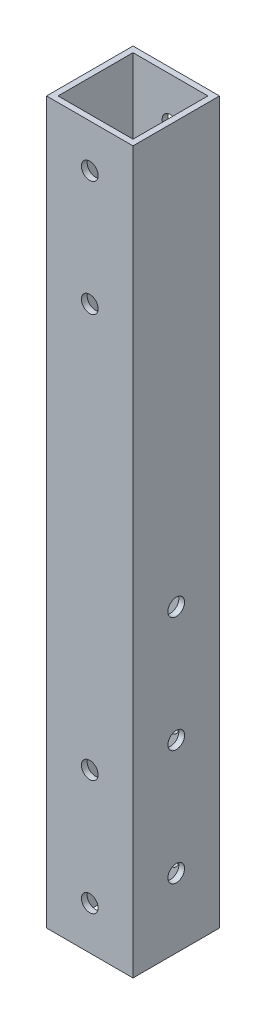
ISO-10303-21;
HEADER;
FILE_DESCRIPTION(('STEP AP214'),'2;1');
FILE_NAME('part.step','',(''),(''),'','','');
FILE_SCHEMA(('AUTOMOTIVE_DESIGN { 1 0 10303 214 1 1 1 1 }'));
ENDSEC;
DATA;
#1=APPLICATION_CONTEXT('core data for automotive mechanical design processes');
#2=APPLICATION_PROTOCOL_DEFINITION('international standard','automotive_design',2000,#1);
#3=PRODUCT_CONTEXT('',#1,'mechanical');
#4=PRODUCT('Part','Part','',(#3));
#5=PRODUCT_RELATED_PRODUCT_CATEGORY('part','',(#4));
#6=PRODUCT_DEFINITION_FORMATION('','',#4);
#7=PRODUCT_DEFINITION_CONTEXT('part definition',#1,'design');
#8=PRODUCT_DEFINITION('design','',#6,#7);
#9=PRODUCT_DEFINITION_SHAPE('','',#8);
#10=(LENGTH_UNIT() NAMED_UNIT(*) SI_UNIT(.MILLI.,.METRE.));
#11=(NAMED_UNIT(*) PLANE_ANGLE_UNIT() SI_UNIT($,.RADIAN.));
#12=(NAMED_UNIT(*) SI_UNIT($,.STERADIAN.) SOLID_ANGLE_UNIT());
#13=UNCERTAINTY_MEASURE_WITH_UNIT(LENGTH_MEASURE(1.E-05),#10,'distance_accuracy_value','');
#14=(GEOMETRIC_REPRESENTATION_CONTEXT(3) GLOBAL_UNCERTAINTY_ASSIGNED_CONTEXT((#13)) GLOBAL_UNIT_ASSIGNED_CONTEXT((#10,
#11,#12)) REPRESENTATION_CONTEXT('',''));
#15=CARTESIAN_POINT('',(0.,0.,0.));
#16=DIRECTION('',(0.,0.,1.));
#17=DIRECTION('',(1.,0.,0.));
#18=AXIS2_PLACEMENT_3D('',#15,#16,#17);
#19=CARTESIAN_POINT('',(0.,125.,0.));
#20=DIRECTION('',(0.,1.,0.));
#21=DIRECTION('',(0.,0.,1.));
#22=AXIS2_PLACEMENT_3D('',#19,#20,#21);
#23=PLANE('',#22);
#24=DIRECTION('',(0.,0.,-1.));
#25=VECTOR('',#24,1.);
#26=CARTESIAN_POINT('',(7.5,125.,7.5));
#27=LINE('',#26,#25);
#28=CARTESIAN_POINT('',(7.5,125.,7.5));
#29=VERTEX_POINT('',#28);
#30=CARTESIAN_POINT('',(7.5,125.,-7.5));
#31=VERTEX_POINT('',#30);
#32=EDGE_CURVE('E187',#29,#31,#27,.T.);
#33=ORIENTED_EDGE('',*,*,#32,.T.);
#34=DIRECTION('',(-1.,0.,0.));
#35=VECTOR('',#34,1.);
#36=CARTESIAN_POINT('',(-7.5,125.,-7.5));
#37=LINE('',#36,#35);
#38=CARTESIAN_POINT('',(-7.5,125.,-7.5));
#39=VERTEX_POINT('',#38);
#40=EDGE_CURVE('E191',#31,#39,#37,.T.);
#41=ORIENTED_EDGE('',*,*,#40,.T.);
#42=DIRECTION('',(0.,0.,1.));
#43=VECTOR('',#42,1.);
#44=CARTESIAN_POINT('',(-7.5,125.,7.5));
#45=LINE('',#44,#43);
#46=CARTESIAN_POINT('',(-7.5,125.,7.5));
#47=VERTEX_POINT('',#46);
#48=EDGE_CURVE('E195',#39,#47,#45,.T.);
#49=ORIENTED_EDGE('',*,*,#48,.T.);
#50=DIRECTION('',(1.,0.,0.));
#51=VECTOR('',#50,1.);
#52=CARTESIAN_POINT('',(-7.5,125.,7.5));
#53=LINE('',#52,#51);
#54=EDGE_CURVE('E198',#47,#29,#53,.T.);
#55=ORIENTED_EDGE('',*,*,#54,.T.);
#56=EDGE_LOOP('',(#33,#41,#49,#55));
#57=FACE_BOUND('',#56,.T.);
#58=DIRECTION('',(-1.,0.,0.));
#59=VECTOR('',#58,1.);
#60=CARTESIAN_POINT('',(0.,125.,-6.5));
#61=LINE('',#60,#59);
#62=CARTESIAN_POINT('',(6.5,125.,-6.5));
#63=VERTEX_POINT('',#62);
#64=CARTESIAN_POINT('',(-6.5,125.,-6.5));
#65=VERTEX_POINT('',#64);
#66=EDGE_CURVE('E146',#63,#65,#61,.T.);
#67=ORIENTED_EDGE('',*,*,#66,.F.);
#68=DIRECTION('',(0.,0.,-1.));
#69=VECTOR('',#68,1.);
#70=CARTESIAN_POINT('',(6.5,125.,0.));
#71=LINE('',#70,#69);
#72=CARTESIAN_POINT('',(6.5,125.,6.5));
#73=VERTEX_POINT('',#72);
#74=EDGE_CURVE('E137',#73,#63,#71,.T.);
#75=ORIENTED_EDGE('',*,*,#74,.F.);
#76=DIRECTION('',(1.,0.,0.));
#77=VECTOR('',#76,1.);
#78=CARTESIAN_POINT('',(0.,125.,6.5));
#79=LINE('',#78,#77);
#80=CARTESIAN_POINT('',(-6.5,125.,6.5));
#81=VERTEX_POINT('',#80);
#82=EDGE_CURVE('E163',#81,#73,#79,.T.);
#83=ORIENTED_EDGE('',*,*,#82,.F.);
#84=DIRECTION('',(0.,0.,1.));
#85=VECTOR('',#84,1.);
#86=CARTESIAN_POINT('',(-6.5,125.,0.));
#87=LINE('',#86,#85);
#88=EDGE_CURVE('E159',#65,#81,#87,.T.);
#89=ORIENTED_EDGE('',*,*,#88,.F.);
#90=EDGE_LOOP('',(#67,#75,#83,#89));
#91=FACE_BOUND('',#90,.T.);
#92=ADVANCED_FACE('F69',(#57,#91),#23,.T.);
#93=CARTESIAN_POINT('',(0.,0.,0.));
#94=DIRECTION('',(0.,1.,0.));
#95=DIRECTION('',(0.,0.,1.));
#96=AXIS2_PLACEMENT_3D('',#93,#94,#95);
#97=PLANE('',#96);
#98=DIRECTION('',(0.,0.,-1.));
#99=VECTOR('',#98,1.);
#100=CARTESIAN_POINT('',(7.5,0.,7.5));
#101=LINE('',#100,#99);
#102=CARTESIAN_POINT('',(7.5,0.,7.5));
#103=VERTEX_POINT('',#102);
#104=CARTESIAN_POINT('',(7.5,0.,-7.5));
#105=VERTEX_POINT('',#104);
#106=EDGE_CURVE('E155',#103,#105,#101,.T.);
#107=ORIENTED_EDGE('',*,*,#106,.F.);
#108=DIRECTION('',(1.,0.,0.));
#109=VECTOR('',#108,1.);
#110=CARTESIAN_POINT('',(-7.5,0.,7.5));
#111=LINE('',#110,#109);
#112=CARTESIAN_POINT('',(-7.5,0.,7.5));
#113=VERTEX_POINT('',#112);
#114=EDGE_CURVE('E192',#113,#103,#111,.T.);
#115=ORIENTED_EDGE('',*,*,#114,.F.);
#116=DIRECTION('',(0.,0.,1.));
#117=VECTOR('',#116,1.);
#118=CARTESIAN_POINT('',(-7.5,0.,7.5));
#119=LINE('',#118,#117);
#120=CARTESIAN_POINT('',(-7.5,0.,-7.5));
#121=VERTEX_POINT('',#120);
#122=EDGE_CURVE('E208',#121,#113,#119,.T.);
#123=ORIENTED_EDGE('',*,*,#122,.F.);
#124=DIRECTION('',(-1.,0.,0.));
#125=VECTOR('',#124,1.);
#126=CARTESIAN_POINT('',(-7.5,0.,-7.5));
#127=LINE('',#126,#125);
#128=EDGE_CURVE('E205',#105,#121,#127,.T.);
#129=ORIENTED_EDGE('',*,*,#128,.F.);
#130=EDGE_LOOP('',(#107,#115,#123,#129));
#131=FACE_BOUND('',#130,.T.);
#132=DIRECTION('',(0.,0.,-1.));
#133=VECTOR('',#132,1.);
#134=CARTESIAN_POINT('',(6.5,0.,0.));
#135=LINE('',#134,#133);
#136=CARTESIAN_POINT('',(6.5,0.,6.5));
#137=VERTEX_POINT('',#136);
#138=CARTESIAN_POINT('',(6.5,0.,-6.5));
#139=VERTEX_POINT('',#138);
#140=EDGE_CURVE('E95',#137,#139,#135,.T.);
#141=ORIENTED_EDGE('',*,*,#140,.T.);
#142=DIRECTION('',(-1.,0.,0.));
#143=VECTOR('',#142,1.);
#144=CARTESIAN_POINT('',(0.,0.,-6.5));
#145=LINE('',#144,#143);
#146=CARTESIAN_POINT('',(-6.5,0.,-6.5));
#147=VERTEX_POINT('',#146);
#148=EDGE_CURVE('E153',#139,#147,#145,.T.);
#149=ORIENTED_EDGE('',*,*,#148,.T.);
#150=DIRECTION('',(0.,0.,1.));
#151=VECTOR('',#150,1.);
#152=CARTESIAN_POINT('',(-6.5,0.,0.));
#153=LINE('',#152,#151);
#154=CARTESIAN_POINT('',(-6.5,0.,6.5));
#155=VERTEX_POINT('',#154);
#156=EDGE_CURVE('E174',#147,#155,#153,.T.);
#157=ORIENTED_EDGE('',*,*,#156,.T.);
#158=DIRECTION('',(1.,0.,0.));
#159=VECTOR('',#158,1.);
#160=CARTESIAN_POINT('',(0.,0.,6.5));
#161=LINE('',#160,#159);
#162=EDGE_CURVE('E147',#155,#137,#161,.T.);
#163=ORIENTED_EDGE('',*,*,#162,.T.);
#164=EDGE_LOOP('',(#141,#149,#157,#163));
#165=FACE_BOUND('',#164,.T.);
#166=ADVANCED_FACE('F349',(#131,#165),#97,.F.);
#167=CARTESIAN_POINT('',(7.5,125.,7.5));
#168=DIRECTION('',(-1.,0.,0.));
#169=DIRECTION('',(0.,0.,1.));
#170=AXIS2_PLACEMENT_3D('',#167,#168,#169);
#171=PLANE('',#170);
#172=CARTESIAN_POINT('',(7.5,52.,0.));
#173=DIRECTION('',(1.,0.,0.));
#174=DIRECTION('',(0.,0.,-1.));
#175=AXIS2_PLACEMENT_3D('',#172,#173,#174);
#176=CIRCLE('',#175,1.45);
#177=CARTESIAN_POINT('',(7.5,52.,-1.45));
#178=VERTEX_POINT('',#177);
#179=EDGE_CURVE('E393',#178,#178,#176,.T.);
#180=ORIENTED_EDGE('',*,*,#179,.F.);
#181=EDGE_LOOP('',(#180));
#182=FACE_BOUND('',#181,.T.);
#183=CARTESIAN_POINT('',(7.5,12.,0.));
#184=DIRECTION('',(1.,0.,0.));
#185=DIRECTION('',(0.,0.,-1.));
#186=AXIS2_PLACEMENT_3D('',#183,#184,#185);
#187=CIRCLE('',#186,1.45);
#188=CARTESIAN_POINT('',(7.5,12.,-1.45));
#189=VERTEX_POINT('',#188);
#190=EDGE_CURVE('E389',#189,#189,#187,.T.);
#191=ORIENTED_EDGE('',*,*,#190,.F.);
#192=EDGE_LOOP('',(#191));
#193=FACE_BOUND('',#192,.T.);
#194=CARTESIAN_POINT('',(7.5,32.,0.));
#195=DIRECTION('',(1.,0.,0.));
#196=DIRECTION('',(0.,0.,-1.));
#197=AXIS2_PLACEMENT_3D('',#194,#195,#196);
#198=CIRCLE('',#197,1.45);
#199=CARTESIAN_POINT('',(7.5,32.,-1.45));
#200=VERTEX_POINT('',#199);
#201=EDGE_CURVE('E263',#200,#200,#198,.T.);
#202=ORIENTED_EDGE('',*,*,#201,.F.);
#203=EDGE_LOOP('',(#202));
#204=FACE_BOUND('',#203,.T.);
#205=ORIENTED_EDGE('',*,*,#106,.T.);
#206=DIRECTION('',(0.,-1.,0.));
#207=VECTOR('',#206,1.);
#208=CARTESIAN_POINT('',(7.5,125.,-7.5));
#209=LINE('',#208,#207);
#210=EDGE_CURVE('E12',#31,#105,#209,.T.);
#211=ORIENTED_EDGE('',*,*,#210,.F.);
#212=ORIENTED_EDGE('',*,*,#32,.F.);
#213=DIRECTION('',(0.,-1.,0.));
#214=VECTOR('',#213,1.);
#215=CARTESIAN_POINT('',(7.5,125.,7.5));
#216=LINE('',#215,#214);
#217=EDGE_CURVE('E201',#29,#103,#216,.T.);
#218=ORIENTED_EDGE('',*,*,#217,.T.);
#219=EDGE_LOOP('',(#205,#211,#212,#218));
#220=FACE_BOUND('',#219,.T.);
#221=ADVANCED_FACE('F71',(#182,#193,#204,#220),#171,.F.);
#222=CARTESIAN_POINT('',(-7.5,125.,-7.5));
#223=DIRECTION('',(0.,0.,1.));
#224=DIRECTION('',(1.,0.,0.));
#225=AXIS2_PLACEMENT_3D('',#222,#223,#224);
#226=PLANE('',#225);
#227=CARTESIAN_POINT('',(0.,7.5,-7.5));
#228=DIRECTION('',(0.,0.,1.));
#229=DIRECTION('',(1.,0.,0.));
#230=AXIS2_PLACEMENT_3D('',#227,#228,#229);
#231=CIRCLE('',#230,1.45);
#232=CARTESIAN_POINT('',(1.45,7.5,-7.5));
#233=VERTEX_POINT('',#232);
#234=EDGE_CURVE('E228',#233,#233,#231,.T.);
#235=ORIENTED_EDGE('',*,*,#234,.T.);
#236=EDGE_LOOP('',(#235));
#237=FACE_BOUND('',#236,.T.);
#238=CARTESIAN_POINT('',(0.,27.5,-7.5));
#239=DIRECTION('',(0.,0.,1.));
#240=DIRECTION('',(1.,0.,0.));
#241=AXIS2_PLACEMENT_3D('',#238,#239,#240);
#242=CIRCLE('',#241,1.45);
#243=CARTESIAN_POINT('',(1.45,27.5,-7.5));
#244=VERTEX_POINT('',#243);
#245=EDGE_CURVE('E282',#244,#244,#242,.T.);
#246=ORIENTED_EDGE('',*,*,#245,.T.);
#247=EDGE_LOOP('',(#246));
#248=FACE_BOUND('',#247,.T.);
#249=CARTESIAN_POINT('',(0.,97.5,-7.5));
#250=DIRECTION('',(0.,0.,1.));
#251=DIRECTION('',(-1.,0.,0.));
#252=AXIS2_PLACEMENT_3D('',#249,#250,#251);
#253=CIRCLE('',#252,1.45);
#254=CARTESIAN_POINT('',(-1.45,97.5,-7.5));
#255=VERTEX_POINT('',#254);
#256=EDGE_CURVE('E290',#255,#255,#253,.T.);
#257=ORIENTED_EDGE('',*,*,#256,.T.);
#258=EDGE_LOOP('',(#257));
#259=FACE_BOUND('',#258,.T.);
#260=CARTESIAN_POINT('',(0.,117.5,-7.5));
#261=DIRECTION('',(0.,0.,1.));
#262=DIRECTION('',(-1.,0.,0.));
#263=AXIS2_PLACEMENT_3D('',#260,#261,#262);
#264=CIRCLE('',#263,1.45);
#265=CARTESIAN_POINT('',(-1.45,117.5,-7.5));
#266=VERTEX_POINT('',#265);
#267=EDGE_CURVE('E270',#266,#266,#264,.T.);
#268=ORIENTED_EDGE('',*,*,#267,.T.);
#269=EDGE_LOOP('',(#268));
#270=FACE_BOUND('',#269,.T.);
#271=ORIENTED_EDGE('',*,*,#128,.T.);
#272=DIRECTION('',(0.,-1.,0.));
#273=VECTOR('',#272,1.);
#274=CARTESIAN_POINT('',(-7.5,125.,-7.5));
#275=LINE('',#274,#273);
#276=EDGE_CURVE('E79',#39,#121,#275,.T.);
#277=ORIENTED_EDGE('',*,*,#276,.F.);
#278=ORIENTED_EDGE('',*,*,#40,.F.);
#279=ORIENTED_EDGE('',*,*,#210,.T.);
#280=EDGE_LOOP('',(#271,#277,#278,#279));
#281=FACE_BOUND('',#280,.T.);
#282=ADVANCED_FACE('F335',(#237,#248,#259,#270,#281),#226,.F.);
#283=CARTESIAN_POINT('',(-7.5,125.,7.5));
#284=DIRECTION('',(1.,0.,0.));
#285=DIRECTION('',(0.,0.,-1.));
#286=AXIS2_PLACEMENT_3D('',#283,#284,#285);
#287=PLANE('',#286);
#288=CARTESIAN_POINT('',(-7.5,52.,0.));
#289=DIRECTION('',(1.,0.,0.));
#290=DIRECTION('',(0.,0.,-1.));
#291=AXIS2_PLACEMENT_3D('',#288,#289,#290);
#292=CIRCLE('',#291,1.45);
#293=CARTESIAN_POINT('',(-7.5,52.,-1.45));
#294=VERTEX_POINT('',#293);
#295=EDGE_CURVE('E378',#294,#294,#292,.T.);
#296=ORIENTED_EDGE('',*,*,#295,.T.);
#297=EDGE_LOOP('',(#296));
#298=FACE_BOUND('',#297,.T.);
#299=CARTESIAN_POINT('',(-7.5,12.,0.));
#300=DIRECTION('',(1.,0.,0.));
#301=DIRECTION('',(0.,0.,-1.));
#302=AXIS2_PLACEMENT_3D('',#299,#300,#301);
#303=CIRCLE('',#302,1.45);
#304=CARTESIAN_POINT('',(-7.5,12.,-1.45));
#305=VERTEX_POINT('',#304);
#306=EDGE_CURVE('E382',#305,#305,#303,.T.);
#307=ORIENTED_EDGE('',*,*,#306,.T.);
#308=EDGE_LOOP('',(#307));
#309=FACE_BOUND('',#308,.T.);
#310=CARTESIAN_POINT('',(-7.5,32.,0.));
#311=DIRECTION('',(1.,0.,0.));
#312=DIRECTION('',(0.,0.,-1.));
#313=AXIS2_PLACEMENT_3D('',#310,#311,#312);
#314=CIRCLE('',#313,1.45);
#315=CARTESIAN_POINT('',(-7.5,32.,-1.45));
#316=VERTEX_POINT('',#315);
#317=EDGE_CURVE('E247',#316,#316,#314,.T.);
#318=ORIENTED_EDGE('',*,*,#317,.T.);
#319=EDGE_LOOP('',(#318));
#320=FACE_BOUND('',#319,.T.);
#321=ORIENTED_EDGE('',*,*,#122,.T.);
#322=DIRECTION('',(0.,-1.,0.));
#323=VECTOR('',#322,1.);
#324=CARTESIAN_POINT('',(-7.5,125.,7.5));
#325=LINE('',#324,#323);
#326=EDGE_CURVE('E216',#47,#113,#325,.T.);
#327=ORIENTED_EDGE('',*,*,#326,.F.);
#328=ORIENTED_EDGE('',*,*,#48,.F.);
#329=ORIENTED_EDGE('',*,*,#276,.T.);
#330=EDGE_LOOP('',(#321,#327,#328,#329));
#331=FACE_BOUND('',#330,.T.);
#332=ADVANCED_FACE('F338',(#298,#309,#320,#331),#287,.F.);
#333=CARTESIAN_POINT('',(-7.5,125.,7.5));
#334=DIRECTION('',(0.,0.,-1.));
#335=DIRECTION('',(-1.,0.,0.));
#336=AXIS2_PLACEMENT_3D('',#333,#334,#335);
#337=PLANE('',#336);
#338=CARTESIAN_POINT('',(0.,7.5,7.5));
#339=DIRECTION('',(0.,0.,1.));
#340=DIRECTION('',(1.,0.,0.));
#341=AXIS2_PLACEMENT_3D('',#338,#339,#340);
#342=CIRCLE('',#341,1.45);
#343=CARTESIAN_POINT('',(1.45,7.5,7.5));
#344=VERTEX_POINT('',#343);
#345=EDGE_CURVE('E274',#344,#344,#342,.T.);
#346=ORIENTED_EDGE('',*,*,#345,.F.);
#347=EDGE_LOOP('',(#346));
#348=FACE_BOUND('',#347,.T.);
#349=CARTESIAN_POINT('',(0.,27.5,7.5));
#350=DIRECTION('',(0.,0.,1.));
#351=DIRECTION('',(1.,0.,0.));
#352=AXIS2_PLACEMENT_3D('',#349,#350,#351);
#353=CIRCLE('',#352,1.45);
#354=CARTESIAN_POINT('',(1.45,27.5,7.5));
#355=VERTEX_POINT('',#354);
#356=EDGE_CURVE('E278',#355,#355,#353,.T.);
#357=ORIENTED_EDGE('',*,*,#356,.F.);
#358=EDGE_LOOP('',(#357));
#359=FACE_BOUND('',#358,.T.);
#360=CARTESIAN_POINT('',(0.,97.5,7.5));
#361=DIRECTION('',(0.,0.,1.));
#362=DIRECTION('',(-1.,0.,0.));
#363=AXIS2_PLACEMENT_3D('',#360,#361,#362);
#364=CIRCLE('',#363,1.45);
#365=CARTESIAN_POINT('',(-1.45,97.5,7.5));
#366=VERTEX_POINT('',#365);
#367=EDGE_CURVE('E286',#366,#366,#364,.T.);
#368=ORIENTED_EDGE('',*,*,#367,.F.);
#369=EDGE_LOOP('',(#368));
#370=FACE_BOUND('',#369,.T.);
#371=CARTESIAN_POINT('',(0.,117.5,7.5));
#372=DIRECTION('',(0.,0.,1.));
#373=DIRECTION('',(-1.,0.,0.));
#374=AXIS2_PLACEMENT_3D('',#371,#372,#373);
#375=CIRCLE('',#374,1.45);
#376=CARTESIAN_POINT('',(-1.45,117.5,7.5));
#377=VERTEX_POINT('',#376);
#378=EDGE_CURVE('E294',#377,#377,#375,.T.);
#379=ORIENTED_EDGE('',*,*,#378,.F.);
#380=EDGE_LOOP('',(#379));
#381=FACE_BOUND('',#380,.T.);
#382=ORIENTED_EDGE('',*,*,#114,.T.);
#383=ORIENTED_EDGE('',*,*,#217,.F.);
#384=ORIENTED_EDGE('',*,*,#54,.F.);
#385=ORIENTED_EDGE('',*,*,#326,.T.);
#386=EDGE_LOOP('',(#382,#383,#384,#385));
#387=FACE_BOUND('',#386,.T.);
#388=ADVANCED_FACE('F353',(#348,#359,#370,#381,#387),#337,.F.);
#389=CARTESIAN_POINT('',(6.5,125.,0.));
#390=DIRECTION('',(-1.,0.,0.));
#391=DIRECTION('',(0.,0.,1.));
#392=AXIS2_PLACEMENT_3D('',#389,#390,#391);
#393=PLANE('',#392);
#394=CARTESIAN_POINT('',(6.5,52.,0.));
#395=DIRECTION('',(-1.,0.,0.));
#396=DIRECTION('',(0.,0.,1.));
#397=AXIS2_PLACEMENT_3D('',#394,#395,#396);
#398=CIRCLE('',#397,1.45);
#399=CARTESIAN_POINT('',(6.5,52.,1.45));
#400=VERTEX_POINT('',#399);
#401=EDGE_CURVE('E266',#400,#400,#398,.T.);
#402=ORIENTED_EDGE('',*,*,#401,.F.);
#403=EDGE_LOOP('',(#402));
#404=FACE_BOUND('',#403,.T.);
#405=CARTESIAN_POINT('',(6.5,12.,0.));
#406=DIRECTION('',(-1.,0.,0.));
#407=DIRECTION('',(0.,0.,1.));
#408=AXIS2_PLACEMENT_3D('',#405,#406,#407);
#409=CIRCLE('',#408,1.45);
#410=CARTESIAN_POINT('',(6.5,12.,1.45));
#411=VERTEX_POINT('',#410);
#412=EDGE_CURVE('E251',#411,#411,#409,.T.);
#413=ORIENTED_EDGE('',*,*,#412,.F.);
#414=EDGE_LOOP('',(#413));
#415=FACE_BOUND('',#414,.T.);
#416=CARTESIAN_POINT('',(6.5,32.,0.));
#417=DIRECTION('',(-1.,0.,0.));
#418=DIRECTION('',(0.,0.,1.));
#419=AXIS2_PLACEMENT_3D('',#416,#417,#418);
#420=CIRCLE('',#419,1.45);
#421=CARTESIAN_POINT('',(6.5,32.,1.45));
#422=VERTEX_POINT('',#421);
#423=EDGE_CURVE('E246',#422,#422,#420,.T.);
#424=ORIENTED_EDGE('',*,*,#423,.F.);
#425=EDGE_LOOP('',(#424));
#426=FACE_BOUND('',#425,.T.);
#427=ORIENTED_EDGE('',*,*,#140,.F.);
#428=DIRECTION('',(0.,-1.,0.));
#429=VECTOR('',#428,1.);
#430=CARTESIAN_POINT('',(6.5,125.,6.5));
#431=LINE('',#430,#429);
#432=EDGE_CURVE('E141',#73,#137,#431,.T.);
#433=ORIENTED_EDGE('',*,*,#432,.F.);
#434=ORIENTED_EDGE('',*,*,#74,.T.);
#435=DIRECTION('',(0.,-1.,0.));
#436=VECTOR('',#435,1.);
#437=CARTESIAN_POINT('',(6.5,125.,-6.5));
#438=LINE('',#437,#436);
#439=EDGE_CURVE('E140',#63,#139,#438,.T.);
#440=ORIENTED_EDGE('',*,*,#439,.T.);
#441=EDGE_LOOP('',(#427,#433,#434,#440));
#442=FACE_BOUND('',#441,.T.);
#443=ADVANCED_FACE('F139',(#404,#415,#426,#442),#393,.T.);
#444=CARTESIAN_POINT('',(0.,125.,-6.5));
#445=DIRECTION('',(0.,0.,1.));
#446=DIRECTION('',(1.,0.,0.));
#447=AXIS2_PLACEMENT_3D('',#444,#445,#446);
#448=PLANE('',#447);
#449=CARTESIAN_POINT('',(0.,7.5,-6.5));
#450=DIRECTION('',(0.,0.,1.));
#451=DIRECTION('',(1.,0.,0.));
#452=AXIS2_PLACEMENT_3D('',#449,#450,#451);
#453=CIRCLE('',#452,1.45);
#454=CARTESIAN_POINT('',(1.45,7.5,-6.5));
#455=VERTEX_POINT('',#454);
#456=EDGE_CURVE('E171',#455,#455,#453,.T.);
#457=ORIENTED_EDGE('',*,*,#456,.F.);
#458=EDGE_LOOP('',(#457));
#459=FACE_BOUND('',#458,.T.);
#460=CARTESIAN_POINT('',(0.,27.5,-6.5));
#461=DIRECTION('',(0.,0.,1.));
#462=DIRECTION('',(1.,0.,0.));
#463=AXIS2_PLACEMENT_3D('',#460,#461,#462);
#464=CIRCLE('',#463,1.45);
#465=CARTESIAN_POINT('',(1.45,27.5,-6.5));
#466=VERTEX_POINT('',#465);
#467=EDGE_CURVE('E238',#466,#466,#464,.T.);
#468=ORIENTED_EDGE('',*,*,#467,.F.);
#469=EDGE_LOOP('',(#468));
#470=FACE_BOUND('',#469,.T.);
#471=CARTESIAN_POINT('',(0.,97.5,-6.5));
#472=DIRECTION('',(0.,0.,1.));
#473=DIRECTION('',(1.,0.,0.));
#474=AXIS2_PLACEMENT_3D('',#471,#472,#473);
#475=CIRCLE('',#474,1.45);
#476=CARTESIAN_POINT('',(1.45,97.5,-6.5));
#477=VERTEX_POINT('',#476);
#478=EDGE_CURVE('E233',#477,#477,#475,.T.);
#479=ORIENTED_EDGE('',*,*,#478,.F.);
#480=EDGE_LOOP('',(#479));
#481=FACE_BOUND('',#480,.T.);
#482=CARTESIAN_POINT('',(0.,117.5,-6.5));
#483=DIRECTION('',(0.,0.,1.));
#484=DIRECTION('',(1.,0.,0.));
#485=AXIS2_PLACEMENT_3D('',#482,#483,#484);
#486=CIRCLE('',#485,1.45);
#487=CARTESIAN_POINT('',(1.45,117.5,-6.5));
#488=VERTEX_POINT('',#487);
#489=EDGE_CURVE('E227',#488,#488,#486,.T.);
#490=ORIENTED_EDGE('',*,*,#489,.F.);
#491=EDGE_LOOP('',(#490));
#492=FACE_BOUND('',#491,.T.);
#493=ORIENTED_EDGE('',*,*,#148,.F.);
#494=ORIENTED_EDGE('',*,*,#439,.F.);
#495=ORIENTED_EDGE('',*,*,#66,.T.);
#496=DIRECTION('',(0.,-1.,0.));
#497=VECTOR('',#496,1.);
#498=CARTESIAN_POINT('',(-6.5,125.,-6.5));
#499=LINE('',#498,#497);
#500=EDGE_CURVE('E156',#65,#147,#499,.T.);
#501=ORIENTED_EDGE('',*,*,#500,.T.);
#502=EDGE_LOOP('',(#493,#494,#495,#501));
#503=FACE_BOUND('',#502,.T.);
#504=ADVANCED_FACE('F150',(#459,#470,#481,#492,#503),#448,.T.);
#505=CARTESIAN_POINT('',(-6.5,125.,0.));
#506=DIRECTION('',(1.,0.,0.));
#507=DIRECTION('',(0.,0.,-1.));
#508=AXIS2_PLACEMENT_3D('',#505,#506,#507);
#509=PLANE('',#508);
#510=CARTESIAN_POINT('',(-6.5,52.,0.));
#511=DIRECTION('',(1.,0.,0.));
#512=DIRECTION('',(0.,0.,-1.));
#513=AXIS2_PLACEMENT_3D('',#510,#511,#512);
#514=CIRCLE('',#513,1.45);
#515=CARTESIAN_POINT('',(-6.5,52.,-1.45));
#516=VERTEX_POINT('',#515);
#517=EDGE_CURVE('E73',#516,#516,#514,.T.);
#518=ORIENTED_EDGE('',*,*,#517,.F.);
#519=EDGE_LOOP('',(#518));
#520=FACE_BOUND('',#519,.T.);
#521=CARTESIAN_POINT('',(-6.5,12.,0.));
#522=DIRECTION('',(1.,0.,0.));
#523=DIRECTION('',(0.,0.,-1.));
#524=AXIS2_PLACEMENT_3D('',#521,#522,#523);
#525=CIRCLE('',#524,1.45);
#526=CARTESIAN_POINT('',(-6.5,12.,-1.45));
#527=VERTEX_POINT('',#526);
#528=EDGE_CURVE('E248',#527,#527,#525,.T.);
#529=ORIENTED_EDGE('',*,*,#528,.F.);
#530=EDGE_LOOP('',(#529));
#531=FACE_BOUND('',#530,.T.);
#532=CARTESIAN_POINT('',(-6.5,32.,0.));
#533=DIRECTION('',(1.,0.,0.));
#534=DIRECTION('',(0.,0.,-1.));
#535=AXIS2_PLACEMENT_3D('',#532,#533,#534);
#536=CIRCLE('',#535,1.45);
#537=CARTESIAN_POINT('',(-6.5,32.,-1.45));
#538=VERTEX_POINT('',#537);
#539=EDGE_CURVE('E243',#538,#538,#536,.T.);
#540=ORIENTED_EDGE('',*,*,#539,.F.);
#541=EDGE_LOOP('',(#540));
#542=FACE_BOUND('',#541,.T.);
#543=ORIENTED_EDGE('',*,*,#156,.F.);
#544=ORIENTED_EDGE('',*,*,#500,.F.);
#545=ORIENTED_EDGE('',*,*,#88,.T.);
#546=DIRECTION('',(0.,-1.,0.));
#547=VECTOR('',#546,1.);
#548=CARTESIAN_POINT('',(-6.5,125.,6.5));
#549=LINE('',#548,#547);
#550=EDGE_CURVE('E87',#81,#155,#549,.T.);
#551=ORIENTED_EDGE('',*,*,#550,.T.);
#552=EDGE_LOOP('',(#543,#544,#545,#551));
#553=FACE_BOUND('',#552,.T.);
#554=ADVANCED_FACE('F318',(#520,#531,#542,#553),#509,.T.);
#555=CARTESIAN_POINT('',(0.,125.,6.5));
#556=DIRECTION('',(0.,0.,-1.));
#557=DIRECTION('',(-1.,0.,0.));
#558=AXIS2_PLACEMENT_3D('',#555,#556,#557);
#559=PLANE('',#558);
#560=CARTESIAN_POINT('',(0.,7.5,6.5));
#561=DIRECTION('',(0.,0.,-1.));
#562=DIRECTION('',(-1.,0.,0.));
#563=AXIS2_PLACEMENT_3D('',#560,#561,#562);
#564=CIRCLE('',#563,1.45);
#565=CARTESIAN_POINT('',(-1.45,7.5,6.5));
#566=VERTEX_POINT('',#565);
#567=EDGE_CURVE('E239',#566,#566,#564,.T.);
#568=ORIENTED_EDGE('',*,*,#567,.F.);
#569=EDGE_LOOP('',(#568));
#570=FACE_BOUND('',#569,.T.);
#571=CARTESIAN_POINT('',(0.,27.5,6.5));
#572=DIRECTION('',(0.,0.,-1.));
#573=DIRECTION('',(-1.,0.,0.));
#574=AXIS2_PLACEMENT_3D('',#571,#572,#573);
#575=CIRCLE('',#574,1.45);
#576=CARTESIAN_POINT('',(-1.45,27.5,6.5));
#577=VERTEX_POINT('',#576);
#578=EDGE_CURVE('E234',#577,#577,#575,.T.);
#579=ORIENTED_EDGE('',*,*,#578,.F.);
#580=EDGE_LOOP('',(#579));
#581=FACE_BOUND('',#580,.T.);
#582=CARTESIAN_POINT('',(0.,97.5,6.5));
#583=DIRECTION('',(0.,0.,-1.));
#584=DIRECTION('',(-1.,0.,0.));
#585=AXIS2_PLACEMENT_3D('',#582,#583,#584);
#586=CIRCLE('',#585,1.45);
#587=CARTESIAN_POINT('',(-1.45,97.5,6.5));
#588=VERTEX_POINT('',#587);
#589=EDGE_CURVE('E229',#588,#588,#586,.T.);
#590=ORIENTED_EDGE('',*,*,#589,.F.);
#591=EDGE_LOOP('',(#590));
#592=FACE_BOUND('',#591,.T.);
#593=CARTESIAN_POINT('',(0.,117.5,6.5));
#594=DIRECTION('',(0.,0.,-1.));
#595=DIRECTION('',(-1.,0.,0.));
#596=AXIS2_PLACEMENT_3D('',#593,#594,#595);
#597=CIRCLE('',#596,1.45);
#598=CARTESIAN_POINT('',(-1.45,117.5,6.5));
#599=VERTEX_POINT('',#598);
#600=EDGE_CURVE('E223',#599,#599,#597,.T.);
#601=ORIENTED_EDGE('',*,*,#600,.F.);
#602=EDGE_LOOP('',(#601));
#603=FACE_BOUND('',#602,.T.);
#604=ORIENTED_EDGE('',*,*,#162,.F.);
#605=ORIENTED_EDGE('',*,*,#550,.F.);
#606=ORIENTED_EDGE('',*,*,#82,.T.);
#607=ORIENTED_EDGE('',*,*,#432,.T.);
#608=EDGE_LOOP('',(#604,#605,#606,#607));
#609=FACE_BOUND('',#608,.T.);
#610=ADVANCED_FACE('F436',(#570,#581,#592,#603,#609),#559,.T.);
#611=CARTESIAN_POINT('',(0.,117.5,-7.5));
#612=DIRECTION('',(0.,0.,1.));
#613=DIRECTION('',(1.,0.,0.));
#614=AXIS2_PLACEMENT_3D('',#611,#612,#613);
#615=CYLINDRICAL_SURFACE('',#614,1.45);
#616=ORIENTED_EDGE('',*,*,#600,.T.);
#617=EDGE_LOOP('',(#616));
#618=FACE_BOUND('',#617,.T.);
#619=ORIENTED_EDGE('',*,*,#378,.T.);
#620=EDGE_LOOP('',(#619));
#621=FACE_BOUND('',#620,.T.);
#622=ADVANCED_FACE('F332',(#618,#621),#615,.F.);
#623=CARTESIAN_POINT('',(0.,97.5,-7.5));
#624=DIRECTION('',(0.,0.,1.));
#625=DIRECTION('',(1.,0.,0.));
#626=AXIS2_PLACEMENT_3D('',#623,#624,#625);
#627=CYLINDRICAL_SURFACE('',#626,1.45);
#628=ORIENTED_EDGE('',*,*,#589,.T.);
#629=EDGE_LOOP('',(#628));
#630=FACE_BOUND('',#629,.T.);
#631=ORIENTED_EDGE('',*,*,#367,.T.);
#632=EDGE_LOOP('',(#631));
#633=FACE_BOUND('',#632,.T.);
#634=ADVANCED_FACE('F446',(#630,#633),#627,.F.);
#635=CARTESIAN_POINT('',(0.,27.5,-7.5));
#636=DIRECTION('',(0.,0.,1.));
#637=DIRECTION('',(1.,0.,0.));
#638=AXIS2_PLACEMENT_3D('',#635,#636,#637);
#639=CYLINDRICAL_SURFACE('',#638,1.45);
#640=ORIENTED_EDGE('',*,*,#578,.T.);
#641=EDGE_LOOP('',(#640));
#642=FACE_BOUND('',#641,.T.);
#643=ORIENTED_EDGE('',*,*,#356,.T.);
#644=EDGE_LOOP('',(#643));
#645=FACE_BOUND('',#644,.T.);
#646=ADVANCED_FACE('F453',(#642,#645),#639,.F.);
#647=CARTESIAN_POINT('',(0.,7.5,-7.5));
#648=DIRECTION('',(0.,0.,1.));
#649=DIRECTION('',(1.,0.,0.));
#650=AXIS2_PLACEMENT_3D('',#647,#648,#649);
#651=CYLINDRICAL_SURFACE('',#650,1.45);
#652=ORIENTED_EDGE('',*,*,#567,.T.);
#653=EDGE_LOOP('',(#652));
#654=FACE_BOUND('',#653,.T.);
#655=ORIENTED_EDGE('',*,*,#345,.T.);
#656=EDGE_LOOP('',(#655));
#657=FACE_BOUND('',#656,.T.);
#658=ADVANCED_FACE('F330',(#654,#657),#651,.F.);
#659=ORIENTED_EDGE('',*,*,#489,.T.);
#660=EDGE_LOOP('',(#659));
#661=FACE_BOUND('',#660,.T.);
#662=ORIENTED_EDGE('',*,*,#267,.F.);
#663=EDGE_LOOP('',(#662));
#664=FACE_BOUND('',#663,.T.);
#665=ADVANCED_FACE('F326',(#661,#664),#615,.F.);
#666=ORIENTED_EDGE('',*,*,#478,.T.);
#667=EDGE_LOOP('',(#666));
#668=FACE_BOUND('',#667,.T.);
#669=ORIENTED_EDGE('',*,*,#256,.F.);
#670=EDGE_LOOP('',(#669));
#671=FACE_BOUND('',#670,.T.);
#672=ADVANCED_FACE('F329',(#668,#671),#627,.F.);
#673=ORIENTED_EDGE('',*,*,#467,.T.);
#674=EDGE_LOOP('',(#673));
#675=FACE_BOUND('',#674,.T.);
#676=ORIENTED_EDGE('',*,*,#245,.F.);
#677=EDGE_LOOP('',(#676));
#678=FACE_BOUND('',#677,.T.);
#679=ADVANCED_FACE('F432',(#675,#678),#639,.F.);
#680=ORIENTED_EDGE('',*,*,#456,.T.);
#681=EDGE_LOOP('',(#680));
#682=FACE_BOUND('',#681,.T.);
#683=ORIENTED_EDGE('',*,*,#234,.F.);
#684=EDGE_LOOP('',(#683));
#685=FACE_BOUND('',#684,.T.);
#686=ADVANCED_FACE('F313',(#682,#685),#651,.F.);
#687=CARTESIAN_POINT('',(-7.5,32.,0.));
#688=DIRECTION('',(1.,0.,0.));
#689=DIRECTION('',(0.,0.,-1.));
#690=AXIS2_PLACEMENT_3D('',#687,#688,#689);
#691=CYLINDRICAL_SURFACE('',#690,1.45);
#692=ORIENTED_EDGE('',*,*,#539,.T.);
#693=EDGE_LOOP('',(#692));
#694=FACE_BOUND('',#693,.T.);
#695=ORIENTED_EDGE('',*,*,#317,.F.);
#696=EDGE_LOOP('',(#695));
#697=FACE_BOUND('',#696,.T.);
#698=ADVANCED_FACE('F413',(#694,#697),#691,.F.);
#699=CARTESIAN_POINT('',(-7.5,12.,0.));
#700=DIRECTION('',(1.,0.,0.));
#701=DIRECTION('',(0.,0.,-1.));
#702=AXIS2_PLACEMENT_3D('',#699,#700,#701);
#703=CYLINDRICAL_SURFACE('',#702,1.45);
#704=ORIENTED_EDGE('',*,*,#528,.T.);
#705=EDGE_LOOP('',(#704));
#706=FACE_BOUND('',#705,.T.);
#707=ORIENTED_EDGE('',*,*,#306,.F.);
#708=EDGE_LOOP('',(#707));
#709=FACE_BOUND('',#708,.T.);
#710=ADVANCED_FACE('F421',(#706,#709),#703,.F.);
#711=CARTESIAN_POINT('',(-7.5,52.,0.));
#712=DIRECTION('',(1.,0.,0.));
#713=DIRECTION('',(0.,0.,-1.));
#714=AXIS2_PLACEMENT_3D('',#711,#712,#713);
#715=CYLINDRICAL_SURFACE('',#714,1.45);
#716=ORIENTED_EDGE('',*,*,#517,.T.);
#717=EDGE_LOOP('',(#716));
#718=FACE_BOUND('',#717,.T.);
#719=ORIENTED_EDGE('',*,*,#295,.F.);
#720=EDGE_LOOP('',(#719));
#721=FACE_BOUND('',#720,.T.);
#722=ADVANCED_FACE('F411',(#718,#721),#715,.F.);
#723=ORIENTED_EDGE('',*,*,#423,.T.);
#724=EDGE_LOOP('',(#723));
#725=FACE_BOUND('',#724,.T.);
#726=ORIENTED_EDGE('',*,*,#201,.T.);
#727=EDGE_LOOP('',(#726));
#728=FACE_BOUND('',#727,.T.);
#729=ADVANCED_FACE('F409',(#725,#728),#691,.F.);
#730=ORIENTED_EDGE('',*,*,#412,.T.);
#731=EDGE_LOOP('',(#730));
#732=FACE_BOUND('',#731,.T.);
#733=ORIENTED_EDGE('',*,*,#190,.T.);
#734=EDGE_LOOP('',(#733));
#735=FACE_BOUND('',#734,.T.);
#736=ADVANCED_FACE('F403',(#732,#735),#703,.F.);
#737=ORIENTED_EDGE('',*,*,#401,.T.);
#738=EDGE_LOOP('',(#737));
#739=FACE_BOUND('',#738,.T.);
#740=ORIENTED_EDGE('',*,*,#179,.T.);
#741=EDGE_LOOP('',(#740));
#742=FACE_BOUND('',#741,.T.);
#743=ADVANCED_FACE('F418',(#739,#742),#715,.F.);
#744=CLOSED_SHELL('',(#92,#166,#221,#282,#332,#388,#443,#504,#554,#610,#622,#634,#646,#658,#665,
#672,#679,#686,#698,#710,#722,#729,#736,#743));
#745=MANIFOLD_SOLID_BREP('B2',#744);
#746=ADVANCED_BREP_SHAPE_REPRESENTATION('',(#18,#745),#14);
#747=SHAPE_DEFINITION_REPRESENTATION(#9,#746);
ENDSEC;
END-ISO-10303-21;
